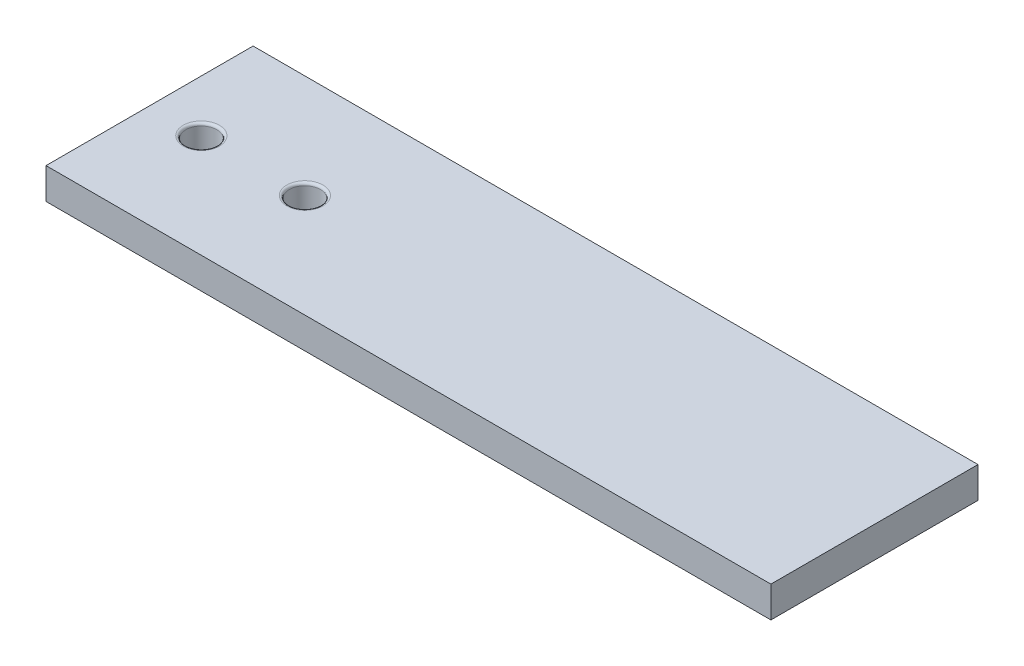
ISO-10303-21;
HEADER;
FILE_DESCRIPTION(('STEP AP214'),'2;1');
FILE_NAME('part.step','',(''),(''),'','','');
FILE_SCHEMA(('AUTOMOTIVE_DESIGN { 1 0 10303 214 1 1 1 1 }'));
ENDSEC;
DATA;
#1=APPLICATION_CONTEXT('core data for automotive mechanical design processes');
#2=APPLICATION_PROTOCOL_DEFINITION('international standard','automotive_design',2000,#1);
#3=PRODUCT_CONTEXT('',#1,'mechanical');
#4=PRODUCT('Part','Part','',(#3));
#5=PRODUCT_RELATED_PRODUCT_CATEGORY('part','',(#4));
#6=PRODUCT_DEFINITION_FORMATION('','',#4);
#7=PRODUCT_DEFINITION_CONTEXT('part definition',#1,'design');
#8=PRODUCT_DEFINITION('design','',#6,#7);
#9=PRODUCT_DEFINITION_SHAPE('','',#8);
#10=(LENGTH_UNIT() NAMED_UNIT(*) SI_UNIT(.MILLI.,.METRE.));
#11=(NAMED_UNIT(*) PLANE_ANGLE_UNIT() SI_UNIT($,.RADIAN.));
#12=(NAMED_UNIT(*) SI_UNIT($,.STERADIAN.) SOLID_ANGLE_UNIT());
#13=UNCERTAINTY_MEASURE_WITH_UNIT(LENGTH_MEASURE(1.E-05),#10,'distance_accuracy_value','');
#14=(GEOMETRIC_REPRESENTATION_CONTEXT(3) GLOBAL_UNCERTAINTY_ASSIGNED_CONTEXT((#13)) GLOBAL_UNIT_ASSIGNED_CONTEXT((#10,
#11,#12)) REPRESENTATION_CONTEXT('',''));
#15=CARTESIAN_POINT('',(0.,0.,0.));
#16=DIRECTION('',(0.,0.,1.));
#17=DIRECTION('',(1.,0.,0.));
#18=AXIS2_PLACEMENT_3D('',#15,#16,#17);
#19=CARTESIAN_POINT('',(0.,3.,0.));
#20=DIRECTION('',(0.,-1.,0.));
#21=DIRECTION('',(0.,0.,-1.));
#22=AXIS2_PLACEMENT_3D('',#19,#20,#21);
#23=PLANE('',#22);
#24=CARTESIAN_POINT('',(-40.,3.,0.));
#25=DIRECTION('',(0.,-1.,0.));
#26=DIRECTION('',(0.,0.,-1.));
#27=AXIS2_PLACEMENT_3D('',#24,#25,#26);
#28=CIRCLE('',#27,3.5);
#29=CARTESIAN_POINT('',(-40.,3.,-3.5));
#30=VERTEX_POINT('',#29);
#31=EDGE_CURVE('E55',#30,#30,#28,.T.);
#32=ORIENTED_EDGE('',*,*,#31,.T.);
#33=EDGE_LOOP('',(#32));
#34=FACE_BOUND('',#33,.T.);
#35=CARTESIAN_POINT('',(-60.,3.,0.));
#36=DIRECTION('',(0.,-1.,0.));
#37=DIRECTION('',(0.,0.,-1.));
#38=AXIS2_PLACEMENT_3D('',#35,#36,#37);
#39=CIRCLE('',#38,3.5);
#40=CARTESIAN_POINT('',(-60.,3.,-3.5));
#41=VERTEX_POINT('',#40);
#42=EDGE_CURVE('E138',#41,#41,#39,.T.);
#43=ORIENTED_EDGE('',*,*,#42,.T.);
#44=EDGE_LOOP('',(#43));
#45=FACE_BOUND('',#44,.T.);
#46=DIRECTION('',(0.,0.,1.));
#47=VECTOR('',#46,1.);
#48=CARTESIAN_POINT('',(-70.,3.,-20.));
#49=LINE('',#48,#47);
#50=CARTESIAN_POINT('',(-70.,3.,-20.));
#51=VERTEX_POINT('',#50);
#52=CARTESIAN_POINT('',(-70.,3.,20.));
#53=VERTEX_POINT('',#52);
#54=EDGE_CURVE('E98',#51,#53,#49,.T.);
#55=ORIENTED_EDGE('',*,*,#54,.T.);
#56=DIRECTION('',(1.,0.,0.));
#57=VECTOR('',#56,1.);
#58=CARTESIAN_POINT('',(70.,3.,20.));
#59=LINE('',#58,#57);
#60=CARTESIAN_POINT('',(70.,3.,20.));
#61=VERTEX_POINT('',#60);
#62=EDGE_CURVE('E94',#53,#61,#59,.T.);
#63=ORIENTED_EDGE('',*,*,#62,.T.);
#64=DIRECTION('',(0.,0.,-1.));
#65=VECTOR('',#64,1.);
#66=CARTESIAN_POINT('',(70.,3.,-20.));
#67=LINE('',#66,#65);
#68=CARTESIAN_POINT('',(70.,3.,-20.));
#69=VERTEX_POINT('',#68);
#70=EDGE_CURVE('E96',#61,#69,#67,.T.);
#71=ORIENTED_EDGE('',*,*,#70,.T.);
#72=DIRECTION('',(-1.,0.,0.));
#73=VECTOR('',#72,1.);
#74=CARTESIAN_POINT('',(70.,3.,-20.));
#75=LINE('',#74,#73);
#76=EDGE_CURVE('E63',#69,#51,#75,.T.);
#77=ORIENTED_EDGE('',*,*,#76,.T.);
#78=EDGE_LOOP('',(#55,#63,#71,#77));
#79=FACE_BOUND('',#78,.T.);
#80=ADVANCED_FACE('F45',(#34,#45,#79),#23,.F.);
#81=CARTESIAN_POINT('',(0.,-3.,0.));
#82=DIRECTION('',(0.,-1.,0.));
#83=DIRECTION('',(0.,0.,-1.));
#84=AXIS2_PLACEMENT_3D('',#81,#82,#83);
#85=PLANE('',#84);
#86=CARTESIAN_POINT('',(-40.,-3.,0.));
#87=DIRECTION('',(0.,1.,0.));
#88=DIRECTION('',(0.,0.,1.));
#89=AXIS2_PLACEMENT_3D('',#86,#87,#88);
#90=CIRCLE('',#89,3.);
#91=CARTESIAN_POINT('',(-40.,-3.,3.));
#92=VERTEX_POINT('',#91);
#93=EDGE_CURVE('E121',#92,#92,#90,.T.);
#94=ORIENTED_EDGE('',*,*,#93,.T.);
#95=EDGE_LOOP('',(#94));
#96=FACE_BOUND('',#95,.T.);
#97=DIRECTION('',(0.,0.,1.));
#98=VECTOR('',#97,1.);
#99=CARTESIAN_POINT('',(-70.,-3.,-20.));
#100=LINE('',#99,#98);
#101=CARTESIAN_POINT('',(-70.,-3.,-20.));
#102=VERTEX_POINT('',#101);
#103=CARTESIAN_POINT('',(-70.,-3.,20.));
#104=VERTEX_POINT('',#103);
#105=EDGE_CURVE('E117',#102,#104,#100,.T.);
#106=ORIENTED_EDGE('',*,*,#105,.F.);
#107=DIRECTION('',(-1.,0.,0.));
#108=VECTOR('',#107,1.);
#109=CARTESIAN_POINT('',(70.,-3.,-20.));
#110=LINE('',#109,#108);
#111=CARTESIAN_POINT('',(70.,-3.,-20.));
#112=VERTEX_POINT('',#111);
#113=EDGE_CURVE('E86',#112,#102,#110,.T.);
#114=ORIENTED_EDGE('',*,*,#113,.F.);
#115=DIRECTION('',(0.,0.,-1.));
#116=VECTOR('',#115,1.);
#117=CARTESIAN_POINT('',(70.,-3.,-20.));
#118=LINE('',#117,#116);
#119=CARTESIAN_POINT('',(70.,-3.,20.));
#120=VERTEX_POINT('',#119);
#121=EDGE_CURVE('E80',#120,#112,#118,.T.);
#122=ORIENTED_EDGE('',*,*,#121,.F.);
#123=DIRECTION('',(1.,0.,0.));
#124=VECTOR('',#123,1.);
#125=CARTESIAN_POINT('',(70.,-3.,20.));
#126=LINE('',#125,#124);
#127=EDGE_CURVE('E104',#104,#120,#126,.T.);
#128=ORIENTED_EDGE('',*,*,#127,.F.);
#129=EDGE_LOOP('',(#106,#114,#122,#128));
#130=FACE_BOUND('',#129,.T.);
#131=CARTESIAN_POINT('',(-60.,-3.,0.));
#132=DIRECTION('',(0.,1.,0.));
#133=DIRECTION('',(0.,0.,1.));
#134=AXIS2_PLACEMENT_3D('',#131,#132,#133);
#135=CIRCLE('',#134,3.);
#136=CARTESIAN_POINT('',(-60.,-3.,3.));
#137=VERTEX_POINT('',#136);
#138=EDGE_CURVE('E162',#137,#137,#135,.T.);
#139=ORIENTED_EDGE('',*,*,#138,.T.);
#140=EDGE_LOOP('',(#139));
#141=FACE_BOUND('',#140,.T.);
#142=ADVANCED_FACE('F170',(#96,#130,#141),#85,.T.);
#143=CARTESIAN_POINT('',(-70.,3.,-20.));
#144=DIRECTION('',(1.,0.,0.));
#145=DIRECTION('',(0.,0.,-1.));
#146=AXIS2_PLACEMENT_3D('',#143,#144,#145);
#147=PLANE('',#146);
#148=ORIENTED_EDGE('',*,*,#105,.T.);
#149=DIRECTION('',(0.,-1.,0.));
#150=VECTOR('',#149,1.);
#151=CARTESIAN_POINT('',(-70.,3.,20.));
#152=LINE('',#151,#150);
#153=EDGE_CURVE('E106',#53,#104,#152,.T.);
#154=ORIENTED_EDGE('',*,*,#153,.F.);
#155=ORIENTED_EDGE('',*,*,#54,.F.);
#156=DIRECTION('',(0.,-1.,0.));
#157=VECTOR('',#156,1.);
#158=CARTESIAN_POINT('',(-70.,3.,-20.));
#159=LINE('',#158,#157);
#160=EDGE_CURVE('E113',#51,#102,#159,.T.);
#161=ORIENTED_EDGE('',*,*,#160,.T.);
#162=EDGE_LOOP('',(#148,#154,#155,#161));
#163=FACE_BOUND('',#162,.T.);
#164=ADVANCED_FACE('F183',(#163),#147,.F.);
#165=CARTESIAN_POINT('',(70.,3.,20.));
#166=DIRECTION('',(0.,0.,-1.));
#167=DIRECTION('',(-1.,0.,0.));
#168=AXIS2_PLACEMENT_3D('',#165,#166,#167);
#169=PLANE('',#168);
#170=ORIENTED_EDGE('',*,*,#127,.T.);
#171=DIRECTION('',(0.,-1.,0.));
#172=VECTOR('',#171,1.);
#173=CARTESIAN_POINT('',(70.,3.,20.));
#174=LINE('',#173,#172);
#175=EDGE_CURVE('E102',#61,#120,#174,.T.);
#176=ORIENTED_EDGE('',*,*,#175,.F.);
#177=ORIENTED_EDGE('',*,*,#62,.F.);
#178=ORIENTED_EDGE('',*,*,#153,.T.);
#179=EDGE_LOOP('',(#170,#176,#177,#178));
#180=FACE_BOUND('',#179,.T.);
#181=ADVANCED_FACE('F103',(#180),#169,.F.);
#182=CARTESIAN_POINT('',(70.,3.,-20.));
#183=DIRECTION('',(-1.,0.,0.));
#184=DIRECTION('',(0.,0.,1.));
#185=AXIS2_PLACEMENT_3D('',#182,#183,#184);
#186=PLANE('',#185);
#187=ORIENTED_EDGE('',*,*,#121,.T.);
#188=DIRECTION('',(0.,-1.,0.));
#189=VECTOR('',#188,1.);
#190=CARTESIAN_POINT('',(70.,3.,-20.));
#191=LINE('',#190,#189);
#192=EDGE_CURVE('E107',#69,#112,#191,.T.);
#193=ORIENTED_EDGE('',*,*,#192,.F.);
#194=ORIENTED_EDGE('',*,*,#70,.F.);
#195=ORIENTED_EDGE('',*,*,#175,.T.);
#196=EDGE_LOOP('',(#187,#193,#194,#195));
#197=FACE_BOUND('',#196,.T.);
#198=ADVANCED_FACE('F109',(#197),#186,.F.);
#199=CARTESIAN_POINT('',(70.,3.,-20.));
#200=DIRECTION('',(0.,0.,1.));
#201=DIRECTION('',(1.,0.,0.));
#202=AXIS2_PLACEMENT_3D('',#199,#200,#201);
#203=PLANE('',#202);
#204=ORIENTED_EDGE('',*,*,#113,.T.);
#205=ORIENTED_EDGE('',*,*,#160,.F.);
#206=ORIENTED_EDGE('',*,*,#76,.F.);
#207=ORIENTED_EDGE('',*,*,#192,.T.);
#208=EDGE_LOOP('',(#204,#205,#206,#207));
#209=FACE_BOUND('',#208,.T.);
#210=ADVANCED_FACE('F156',(#209),#203,.F.);
#211=CARTESIAN_POINT('',(-40.,3.,0.));
#212=DIRECTION('',(0.,-1.,0.));
#213=DIRECTION('',(0.,0.,-1.));
#214=AXIS2_PLACEMENT_3D('',#211,#212,#213);
#215=CYLINDRICAL_SURFACE('',#214,3.);
#216=CARTESIAN_POINT('',(-40.,2.5,0.));
#217=DIRECTION('',(0.,-1.,0.));
#218=DIRECTION('',(0.,0.,-1.));
#219=AXIS2_PLACEMENT_3D('',#216,#217,#218);
#220=CIRCLE('',#219,3.);
#221=CARTESIAN_POINT('',(-40.,2.5,-3.));
#222=VERTEX_POINT('',#221);
#223=EDGE_CURVE('E134',#222,#222,#220,.F.);
#224=ORIENTED_EDGE('',*,*,#223,.T.);
#225=EDGE_LOOP('',(#224));
#226=FACE_BOUND('',#225,.T.);
#227=ORIENTED_EDGE('',*,*,#93,.F.);
#228=EDGE_LOOP('',(#227));
#229=FACE_BOUND('',#228,.T.);
#230=ADVANCED_FACE('F153',(#226,#229),#215,.F.);
#231=CARTESIAN_POINT('',(-60.,3.,0.));
#232=DIRECTION('',(0.,-1.,0.));
#233=DIRECTION('',(0.,0.,-1.));
#234=AXIS2_PLACEMENT_3D('',#231,#232,#233);
#235=CYLINDRICAL_SURFACE('',#234,3.);
#236=CARTESIAN_POINT('',(-60.,2.5,0.));
#237=DIRECTION('',(0.,-1.,0.));
#238=DIRECTION('',(0.,0.,-1.));
#239=AXIS2_PLACEMENT_3D('',#236,#237,#238);
#240=CIRCLE('',#239,3.);
#241=CARTESIAN_POINT('',(-60.,2.5,-3.));
#242=VERTEX_POINT('',#241);
#243=EDGE_CURVE('E11',#242,#242,#240,.F.);
#244=ORIENTED_EDGE('',*,*,#243,.T.);
#245=EDGE_LOOP('',(#244));
#246=FACE_BOUND('',#245,.T.);
#247=ORIENTED_EDGE('',*,*,#138,.F.);
#248=EDGE_LOOP('',(#247));
#249=FACE_BOUND('',#248,.T.);
#250=ADVANCED_FACE('F150',(#246,#249),#235,.F.);
#251=CARTESIAN_POINT('',(-40.,2.5,0.));
#252=DIRECTION('',(0.,-1.,0.));
#253=DIRECTION('',(0.,0.,-1.));
#254=AXIS2_PLACEMENT_3D('',#251,#252,#253);
#255=TOROIDAL_SURFACE('',#254,3.5,0.5);
#256=ORIENTED_EDGE('',*,*,#31,.F.);
#257=EDGE_LOOP('',(#256));
#258=FACE_BOUND('',#257,.T.);
#259=ORIENTED_EDGE('',*,*,#223,.F.);
#260=EDGE_LOOP('',(#259));
#261=FACE_BOUND('',#260,.T.);
#262=ADVANCED_FACE('F147',(#258,#261),#255,.T.);
#263=CARTESIAN_POINT('',(-60.,2.5,0.));
#264=DIRECTION('',(0.,-1.,0.));
#265=DIRECTION('',(0.,0.,-1.));
#266=AXIS2_PLACEMENT_3D('',#263,#264,#265);
#267=TOROIDAL_SURFACE('',#266,3.5,0.5);
#268=ORIENTED_EDGE('',*,*,#42,.F.);
#269=EDGE_LOOP('',(#268));
#270=FACE_BOUND('',#269,.T.);
#271=ORIENTED_EDGE('',*,*,#243,.F.);
#272=EDGE_LOOP('',(#271));
#273=FACE_BOUND('',#272,.T.);
#274=ADVANCED_FACE('F47',(#270,#273),#267,.T.);
#275=CLOSED_SHELL('',(#80,#142,#164,#181,#198,#210,#230,#250,#262,#274));
#276=MANIFOLD_SOLID_BREP('B2',#275);
#277=ADVANCED_BREP_SHAPE_REPRESENTATION('',(#18,#276),#14);
#278=SHAPE_DEFINITION_REPRESENTATION(#9,#277);
ENDSEC;
END-ISO-10303-21;
